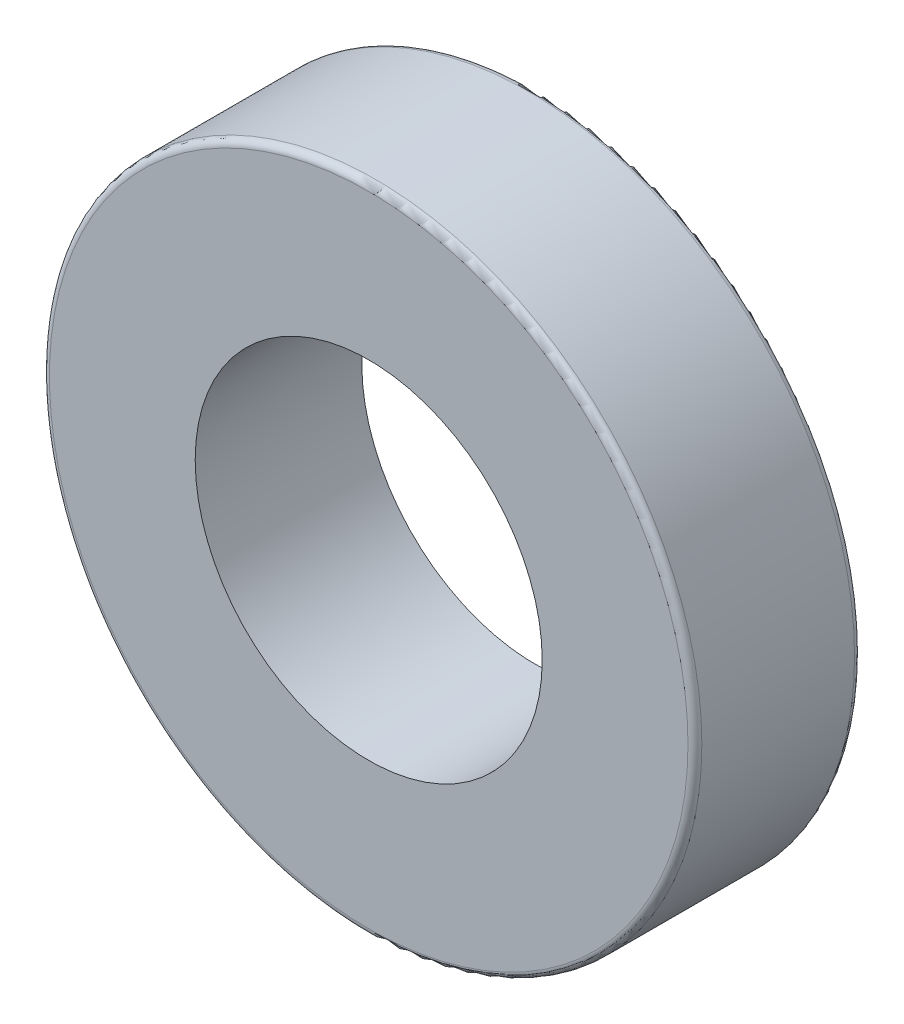
ISO-10303-21;
HEADER;
FILE_DESCRIPTION(('STEP AP214'),'2;1');
FILE_NAME('part.step','',(''),(''),'','','');
FILE_SCHEMA(('AUTOMOTIVE_DESIGN { 1 0 10303 214 1 1 1 1 }'));
ENDSEC;
DATA;
#1=APPLICATION_CONTEXT('core data for automotive mechanical design processes');
#2=APPLICATION_PROTOCOL_DEFINITION('international standard','automotive_design',2000,#1);
#3=PRODUCT_CONTEXT('',#1,'mechanical');
#4=PRODUCT('Part','Part','',(#3));
#5=PRODUCT_RELATED_PRODUCT_CATEGORY('part','',(#4));
#6=PRODUCT_DEFINITION_FORMATION('','',#4);
#7=PRODUCT_DEFINITION_CONTEXT('part definition',#1,'design');
#8=PRODUCT_DEFINITION('design','',#6,#7);
#9=PRODUCT_DEFINITION_SHAPE('','',#8);
#10=(LENGTH_UNIT() NAMED_UNIT(*) SI_UNIT(.MILLI.,.METRE.));
#11=(NAMED_UNIT(*) PLANE_ANGLE_UNIT() SI_UNIT($,.RADIAN.));
#12=(NAMED_UNIT(*) SI_UNIT($,.STERADIAN.) SOLID_ANGLE_UNIT());
#13=UNCERTAINTY_MEASURE_WITH_UNIT(LENGTH_MEASURE(1.E-05),#10,'distance_accuracy_value','');
#14=(GEOMETRIC_REPRESENTATION_CONTEXT(3) GLOBAL_UNCERTAINTY_ASSIGNED_CONTEXT((#13)) GLOBAL_UNIT_ASSIGNED_CONTEXT((#10,
#11,#12)) REPRESENTATION_CONTEXT('',''));
#15=CARTESIAN_POINT('',(0.,0.,0.));
#16=DIRECTION('',(0.,0.,1.));
#17=DIRECTION('',(1.,0.,0.));
#18=AXIS2_PLACEMENT_3D('',#15,#16,#17);
#19=CARTESIAN_POINT('',(0.,0.,12.));
#20=DIRECTION('',(0.,0.,1.));
#21=DIRECTION('',(1.,0.,0.));
#22=AXIS2_PLACEMENT_3D('',#19,#20,#21);
#23=PLANE('',#22);
#24=CARTESIAN_POINT('',(0.,0.,12.));
#25=DIRECTION('',(0.,0.,1.));
#26=DIRECTION('',(1.,0.,0.));
#27=AXIS2_PLACEMENT_3D('',#24,#25,#26);
#28=CIRCLE('',#27,23.);
#29=CARTESIAN_POINT('',(23.,0.,12.));
#30=VERTEX_POINT('',#29);
#31=EDGE_CURVE('E10',#30,#30,#28,.T.);
#32=ORIENTED_EDGE('',*,*,#31,.T.);
#33=EDGE_LOOP('',(#32));
#34=FACE_BOUND('',#33,.T.);
#35=CARTESIAN_POINT('',(0.,0.,12.));
#36=DIRECTION('',(0.,0.,1.));
#37=DIRECTION('',(1.,0.,0.));
#38=AXIS2_PLACEMENT_3D('',#35,#36,#37);
#39=CIRCLE('',#38,12.5);
#40=CARTESIAN_POINT('',(12.5,0.,12.));
#41=VERTEX_POINT('',#40);
#42=EDGE_CURVE('E54',#41,#41,#39,.T.);
#43=ORIENTED_EDGE('',*,*,#42,.F.);
#44=EDGE_LOOP('',(#43));
#45=FACE_BOUND('',#44,.T.);
#46=ADVANCED_FACE('F34',(#34,#45),#23,.T.);
#47=CARTESIAN_POINT('',(0.,0.,0.));
#48=DIRECTION('',(0.,0.,1.));
#49=DIRECTION('',(1.,0.,0.));
#50=AXIS2_PLACEMENT_3D('',#47,#48,#49);
#51=PLANE('',#50);
#52=CARTESIAN_POINT('',(0.,0.,0.));
#53=DIRECTION('',(0.,0.,1.));
#54=DIRECTION('',(1.,0.,0.));
#55=AXIS2_PLACEMENT_3D('',#52,#53,#54);
#56=CIRCLE('',#55,23.);
#57=CARTESIAN_POINT('',(23.,0.,0.));
#58=VERTEX_POINT('',#57);
#59=EDGE_CURVE('E45',#58,#58,#56,.F.);
#60=ORIENTED_EDGE('',*,*,#59,.T.);
#61=EDGE_LOOP('',(#60));
#62=FACE_BOUND('',#61,.T.);
#63=CARTESIAN_POINT('',(0.,0.,0.));
#64=DIRECTION('',(0.,0.,1.));
#65=DIRECTION('',(1.,0.,0.));
#66=AXIS2_PLACEMENT_3D('',#63,#64,#65);
#67=CIRCLE('',#66,12.5);
#68=CARTESIAN_POINT('',(12.5,0.,0.));
#69=VERTEX_POINT('',#68);
#70=EDGE_CURVE('E57',#69,#69,#67,.T.);
#71=ORIENTED_EDGE('',*,*,#70,.T.);
#72=EDGE_LOOP('',(#71));
#73=FACE_BOUND('',#72,.T.);
#74=ADVANCED_FACE('F67',(#62,#73),#51,.F.);
#75=CARTESIAN_POINT('',(0.,0.,12.));
#76=DIRECTION('',(0.,0.,-1.));
#77=DIRECTION('',(-1.,0.,0.));
#78=AXIS2_PLACEMENT_3D('',#75,#76,#77);
#79=CYLINDRICAL_SURFACE('',#78,23.5);
#80=CARTESIAN_POINT('',(0.,0.,0.5));
#81=DIRECTION('',(0.,0.,1.));
#82=DIRECTION('',(1.,0.,0.));
#83=AXIS2_PLACEMENT_3D('',#80,#81,#82);
#84=CIRCLE('',#83,23.5);
#85=CARTESIAN_POINT('',(23.5,0.,0.5));
#86=VERTEX_POINT('',#85);
#87=EDGE_CURVE('E46',#86,#86,#84,.T.);
#88=ORIENTED_EDGE('',*,*,#87,.T.);
#89=EDGE_LOOP('',(#88));
#90=FACE_BOUND('',#89,.T.);
#91=CARTESIAN_POINT('',(0.,0.,11.5));
#92=DIRECTION('',(0.,0.,1.));
#93=DIRECTION('',(1.,0.,0.));
#94=AXIS2_PLACEMENT_3D('',#91,#92,#93);
#95=CIRCLE('',#94,23.5);
#96=CARTESIAN_POINT('',(23.5,0.,11.5));
#97=VERTEX_POINT('',#96);
#98=EDGE_CURVE('E49',#97,#97,#95,.F.);
#99=ORIENTED_EDGE('',*,*,#98,.T.);
#100=EDGE_LOOP('',(#99));
#101=FACE_BOUND('',#100,.T.);
#102=ADVANCED_FACE('F75',(#90,#101),#79,.T.);
#103=CARTESIAN_POINT('',(0.,0.,12.));
#104=DIRECTION('',(0.,0.,-1.));
#105=DIRECTION('',(-1.,0.,0.));
#106=AXIS2_PLACEMENT_3D('',#103,#104,#105);
#107=CYLINDRICAL_SURFACE('',#106,12.5);
#108=ORIENTED_EDGE('',*,*,#42,.T.);
#109=EDGE_LOOP('',(#108));
#110=FACE_BOUND('',#109,.T.);
#111=ORIENTED_EDGE('',*,*,#70,.F.);
#112=EDGE_LOOP('',(#111));
#113=FACE_BOUND('',#112,.T.);
#114=ADVANCED_FACE('F65',(#110,#113),#107,.F.);
#115=CARTESIAN_POINT('',(0.,0.,0.5));
#116=DIRECTION('',(0.,0.,1.));
#117=DIRECTION('',(1.,0.,0.));
#118=AXIS2_PLACEMENT_3D('',#115,#116,#117);
#119=TOROIDAL_SURFACE('',#118,23.,0.5);
#120=ORIENTED_EDGE('',*,*,#59,.F.);
#121=EDGE_LOOP('',(#120));
#122=FACE_BOUND('',#121,.T.);
#123=ORIENTED_EDGE('',*,*,#87,.F.);
#124=EDGE_LOOP('',(#123));
#125=FACE_BOUND('',#124,.T.);
#126=ADVANCED_FACE('F76',(#122,#125),#119,.T.);
#127=CARTESIAN_POINT('',(0.,0.,11.5));
#128=DIRECTION('',(0.,0.,1.));
#129=DIRECTION('',(1.,0.,0.));
#130=AXIS2_PLACEMENT_3D('',#127,#128,#129);
#131=TOROIDAL_SURFACE('',#130,23.,0.5);
#132=ORIENTED_EDGE('',*,*,#98,.F.);
#133=EDGE_LOOP('',(#132));
#134=FACE_BOUND('',#133,.T.);
#135=ORIENTED_EDGE('',*,*,#31,.F.);
#136=EDGE_LOOP('',(#135));
#137=FACE_BOUND('',#136,.T.);
#138=ADVANCED_FACE('F40',(#134,#137),#131,.T.);
#139=CLOSED_SHELL('',(#46,#74,#102,#114,#126,#138));
#140=MANIFOLD_SOLID_BREP('B2',#139);
#141=ADVANCED_BREP_SHAPE_REPRESENTATION('',(#18,#140),#14);
#142=SHAPE_DEFINITION_REPRESENTATION(#9,#141);
ENDSEC;
END-ISO-10303-21;
